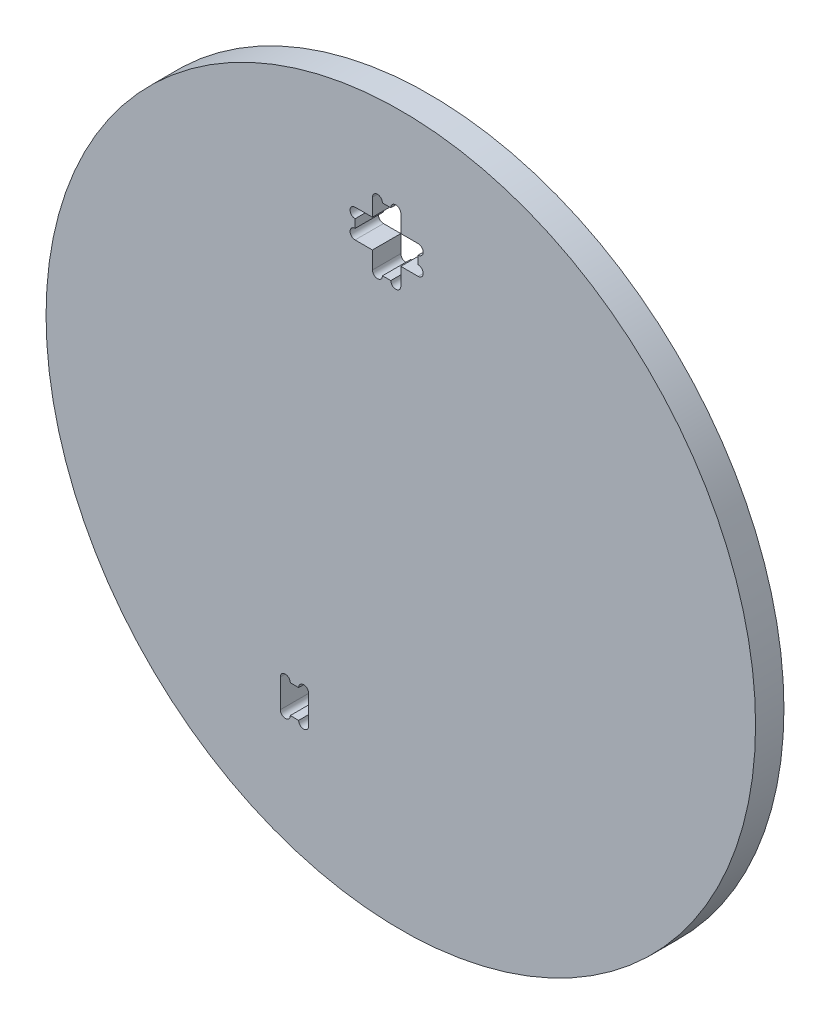
ISO-10303-21;
HEADER;
FILE_DESCRIPTION(('STEP AP214'),'2;1');
FILE_NAME('part.step','',(''),(''),'','','');
FILE_SCHEMA(('AUTOMOTIVE_DESIGN { 1 0 10303 214 1 1 1 1 }'));
ENDSEC;
DATA;
#1=APPLICATION_CONTEXT('core data for automotive mechanical design processes');
#2=APPLICATION_PROTOCOL_DEFINITION('international standard','automotive_design',2000,#1);
#3=PRODUCT_CONTEXT('',#1,'mechanical');
#4=PRODUCT('Part','Part','',(#3));
#5=PRODUCT_RELATED_PRODUCT_CATEGORY('part','',(#4));
#6=PRODUCT_DEFINITION_FORMATION('','',#4);
#7=PRODUCT_DEFINITION_CONTEXT('part definition',#1,'design');
#8=PRODUCT_DEFINITION('design','',#6,#7);
#9=PRODUCT_DEFINITION_SHAPE('','',#8);
#10=(LENGTH_UNIT() NAMED_UNIT(*) SI_UNIT(.MILLI.,.METRE.));
#11=(NAMED_UNIT(*) PLANE_ANGLE_UNIT() SI_UNIT($,.RADIAN.));
#12=(NAMED_UNIT(*) SI_UNIT($,.STERADIAN.) SOLID_ANGLE_UNIT());
#13=UNCERTAINTY_MEASURE_WITH_UNIT(LENGTH_MEASURE(1.E-05),#10,'distance_accuracy_value','');
#14=(GEOMETRIC_REPRESENTATION_CONTEXT(3) GLOBAL_UNCERTAINTY_ASSIGNED_CONTEXT((#13)) GLOBAL_UNIT_ASSIGNED_CONTEXT((#10,
#11,#12)) REPRESENTATION_CONTEXT('',''));
#15=CARTESIAN_POINT('',(0.,0.,0.));
#16=DIRECTION('',(0.,0.,1.));
#17=DIRECTION('',(1.,0.,0.));
#18=AXIS2_PLACEMENT_3D('',#15,#16,#17);
#19=CARTESIAN_POINT('',(0.,0.,18.));
#20=DIRECTION('',(0.,0.,1.));
#21=DIRECTION('',(1.,0.,0.));
#22=AXIS2_PLACEMENT_3D('',#19,#20,#21);
#23=PLANE('',#22);
#24=CARTESIAN_POINT('',(0.,0.,18.));
#25=DIRECTION('',(0.,0.,1.));
#26=DIRECTION('',(1.,0.,0.));
#27=AXIS2_PLACEMENT_3D('',#24,#25,#26);
#28=CIRCLE('',#27,225.);
#29=CARTESIAN_POINT('',(225.,0.,18.));
#30=VERTEX_POINT('',#29);
#31=EDGE_CURVE('E11',#30,#30,#28,.T.);
#32=ORIENTED_EDGE('',*,*,#31,.T.);
#33=EDGE_LOOP('',(#32));
#34=FACE_BOUND('',#33,.T.);
#35=DIRECTION('',(0.,1.,0.));
#36=VECTOR('',#35,1.);
#37=CARTESIAN_POINT('',(-29.,0.,18.));
#38=LINE('',#37,#36);
#39=CARTESIAN_POINT('',(-29.,145.778927822485,18.));
#40=VERTEX_POINT('',#39);
#41=CARTESIAN_POINT('',(-29.,151.078927822484,18.));
#42=VERTEX_POINT('',#41);
#43=EDGE_CURVE('E430',#40,#42,#38,.T.);
#44=ORIENTED_EDGE('',*,*,#43,.T.);
#45=CARTESIAN_POINT('',(-29.,154.253927822484,18.));
#46=DIRECTION('',(0.,0.,1.));
#47=DIRECTION('',(1.,0.,0.));
#48=AXIS2_PLACEMENT_3D('',#45,#46,#47);
#49=CIRCLE('',#48,3.17500000000004);
#50=CARTESIAN_POINT('',(-29.,157.428927822485,18.));
#51=VERTEX_POINT('',#50);
#52=EDGE_CURVE('E433',#42,#51,#49,.F.);
#53=ORIENTED_EDGE('',*,*,#52,.T.);
#54=DIRECTION('',(-1.,0.,0.));
#55=VECTOR('',#54,1.);
#56=CARTESIAN_POINT('',(0.,157.428927822485,18.));
#57=LINE('',#56,#55);
#58=CARTESIAN_POINT('',(-18.,157.428927822485,18.));
#59=VERTEX_POINT('',#58);
#60=EDGE_CURVE('E386',#59,#51,#57,.T.);
#61=ORIENTED_EDGE('',*,*,#60,.F.);
#62=DIRECTION('',(0.,1.,0.));
#63=VECTOR('',#62,1.);
#64=CARTESIAN_POINT('',(-17.9999999999999,0.,18.));
#65=LINE('',#64,#63);
#66=CARTESIAN_POINT('',(-18.,168.428927822484,18.));
#67=VERTEX_POINT('',#66);
#68=EDGE_CURVE('E388',#59,#67,#65,.T.);
#69=ORIENTED_EDGE('',*,*,#68,.T.);
#70=CARTESIAN_POINT('',(-14.8250000000001,168.428927822484,18.));
#71=DIRECTION('',(0.,0.,1.));
#72=DIRECTION('',(1.,0.,0.));
#73=AXIS2_PLACEMENT_3D('',#70,#71,#72);
#74=CIRCLE('',#73,3.17499999999996);
#75=CARTESIAN_POINT('',(-11.6500000000001,168.428927822485,18.));
#76=VERTEX_POINT('',#75);
#77=EDGE_CURVE('E391',#76,#67,#74,.T.);
#78=ORIENTED_EDGE('',*,*,#77,.F.);
#79=DIRECTION('',(-1.,0.,0.));
#80=VECTOR('',#79,1.);
#81=CARTESIAN_POINT('',(0.,168.428927822485,18.));
#82=LINE('',#81,#80);
#83=CARTESIAN_POINT('',(-6.35,168.428927822485,18.));
#84=VERTEX_POINT('',#83);
#85=EDGE_CURVE('E393',#84,#76,#82,.T.);
#86=ORIENTED_EDGE('',*,*,#85,.F.);
#87=CARTESIAN_POINT('',(-3.175,168.428927822484,18.));
#88=DIRECTION('',(0.,0.,1.));
#89=DIRECTION('',(1.,0.,0.));
#90=AXIS2_PLACEMENT_3D('',#87,#88,#89);
#91=CIRCLE('',#90,3.175);
#92=CARTESIAN_POINT('',(0.,168.428927822485,18.));
#93=VERTEX_POINT('',#92);
#94=EDGE_CURVE('E395',#84,#93,#91,.F.);
#95=ORIENTED_EDGE('',*,*,#94,.T.);
#96=DIRECTION('',(0.,1.,0.));
#97=VECTOR('',#96,1.);
#98=CARTESIAN_POINT('',(0.,0.,18.));
#99=LINE('',#98,#97);
#100=CARTESIAN_POINT('',(0.,157.428927822485,18.));
#101=VERTEX_POINT('',#100);
#102=EDGE_CURVE('E398',#101,#93,#99,.T.);
#103=ORIENTED_EDGE('',*,*,#102,.F.);
#104=DIRECTION('',(-1.,0.,0.));
#105=VECTOR('',#104,1.);
#106=CARTESIAN_POINT('',(0.,157.428927822485,18.));
#107=LINE('',#106,#105);
#108=CARTESIAN_POINT('',(11.,157.428927822485,18.));
#109=VERTEX_POINT('',#108);
#110=EDGE_CURVE('E400',#109,#101,#107,.T.);
#111=ORIENTED_EDGE('',*,*,#110,.F.);
#112=CARTESIAN_POINT('',(11.,154.253927822484,18.));
#113=DIRECTION('',(0.,0.,1.));
#114=DIRECTION('',(1.,0.,0.));
#115=AXIS2_PLACEMENT_3D('',#112,#113,#114);
#116=CIRCLE('',#115,3.17500000000004);
#117=CARTESIAN_POINT('',(11.,151.078927822484,18.));
#118=VERTEX_POINT('',#117);
#119=EDGE_CURVE('E402',#118,#109,#116,.T.);
#120=ORIENTED_EDGE('',*,*,#119,.F.);
#121=DIRECTION('',(0.,1.,0.));
#122=VECTOR('',#121,1.);
#123=CARTESIAN_POINT('',(11.,0.,18.));
#124=LINE('',#123,#122);
#125=CARTESIAN_POINT('',(11.,145.778927822485,18.));
#126=VERTEX_POINT('',#125);
#127=EDGE_CURVE('E404',#126,#118,#124,.T.);
#128=ORIENTED_EDGE('',*,*,#127,.F.);
#129=CARTESIAN_POINT('',(11.,142.603927822485,18.));
#130=DIRECTION('',(0.,0.,1.));
#131=DIRECTION('',(1.,0.,0.));
#132=AXIS2_PLACEMENT_3D('',#129,#130,#131);
#133=CIRCLE('',#132,3.17500000000001);
#134=CARTESIAN_POINT('',(11.,139.428927822485,18.));
#135=VERTEX_POINT('',#134);
#136=EDGE_CURVE('E406',#126,#135,#133,.F.);
#137=ORIENTED_EDGE('',*,*,#136,.T.);
#138=DIRECTION('',(-1.,0.,0.));
#139=VECTOR('',#138,1.);
#140=CARTESIAN_POINT('',(0.,139.428927822485,18.));
#141=LINE('',#140,#139);
#142=CARTESIAN_POINT('',(0.,139.428927822485,18.));
#143=VERTEX_POINT('',#142);
#144=EDGE_CURVE('E409',#135,#143,#141,.T.);
#145=ORIENTED_EDGE('',*,*,#144,.T.);
#146=DIRECTION('',(0.,1.,0.));
#147=VECTOR('',#146,1.);
#148=CARTESIAN_POINT('',(0.,0.,18.));
#149=LINE('',#148,#147);
#150=CARTESIAN_POINT('',(0.,128.428927822485,18.));
#151=VERTEX_POINT('',#150);
#152=EDGE_CURVE('E412',#151,#143,#149,.T.);
#153=ORIENTED_EDGE('',*,*,#152,.F.);
#154=CARTESIAN_POINT('',(-3.175,128.428927822485,18.));
#155=DIRECTION('',(0.,0.,1.));
#156=DIRECTION('',(1.,0.,0.));
#157=AXIS2_PLACEMENT_3D('',#154,#155,#156);
#158=CIRCLE('',#157,3.175);
#159=CARTESIAN_POINT('',(-6.35000000000001,128.428927822485,18.));
#160=VERTEX_POINT('',#159);
#161=EDGE_CURVE('E414',#160,#151,#158,.T.);
#162=ORIENTED_EDGE('',*,*,#161,.F.);
#163=DIRECTION('',(-1.,0.,0.));
#164=VECTOR('',#163,1.);
#165=CARTESIAN_POINT('',(0.,128.428927822485,18.));
#166=LINE('',#165,#164);
#167=CARTESIAN_POINT('',(-11.6500000000001,128.428927822485,18.));
#168=VERTEX_POINT('',#167);
#169=EDGE_CURVE('E416',#160,#168,#166,.T.);
#170=ORIENTED_EDGE('',*,*,#169,.T.);
#171=CARTESIAN_POINT('',(-14.8250000000001,128.428927822485,18.));
#172=DIRECTION('',(0.,0.,1.));
#173=DIRECTION('',(1.,0.,0.));
#174=AXIS2_PLACEMENT_3D('',#171,#172,#173);
#175=CIRCLE('',#174,3.17499999999996);
#176=CARTESIAN_POINT('',(-18.,128.428927822484,18.));
#177=VERTEX_POINT('',#176);
#178=EDGE_CURVE('E419',#168,#177,#175,.F.);
#179=ORIENTED_EDGE('',*,*,#178,.T.);
#180=DIRECTION('',(0.,1.,0.));
#181=VECTOR('',#180,1.);
#182=CARTESIAN_POINT('',(-18.,0.,18.));
#183=LINE('',#182,#181);
#184=CARTESIAN_POINT('',(-18.,139.428927822485,18.));
#185=VERTEX_POINT('',#184);
#186=EDGE_CURVE('E422',#177,#185,#183,.T.);
#187=ORIENTED_EDGE('',*,*,#186,.T.);
#188=DIRECTION('',(-1.,0.,0.));
#189=VECTOR('',#188,1.);
#190=CARTESIAN_POINT('',(0.,139.428927822485,18.));
#191=LINE('',#190,#189);
#192=CARTESIAN_POINT('',(-29.,139.428927822485,18.));
#193=VERTEX_POINT('',#192);
#194=EDGE_CURVE('E425',#185,#193,#191,.T.);
#195=ORIENTED_EDGE('',*,*,#194,.T.);
#196=CARTESIAN_POINT('',(-29.,142.603927822485,18.));
#197=DIRECTION('',(0.,0.,1.));
#198=DIRECTION('',(1.,0.,0.));
#199=AXIS2_PLACEMENT_3D('',#196,#197,#198);
#200=CIRCLE('',#199,3.17500000000001);
#201=EDGE_CURVE('E428',#40,#193,#200,.T.);
#202=ORIENTED_EDGE('',*,*,#201,.F.);
#203=EDGE_LOOP('',(#44,#53,#61,#69,#78,#86,#95,#103,#111,#120,#128,#137,#145,#153,#162,#170,
#179,#187,#195,#202));
#204=FACE_BOUND('',#203,.T.);
#205=DIRECTION('',(-1.,0.,0.));
#206=VECTOR('',#205,1.);
#207=CARTESIAN_POINT('',(0.,-124.331072177516,18.));
#208=LINE('',#207,#206);
#209=CARTESIAN_POINT('',(-64.7972921540286,-124.331072177516,18.));
#210=VERTEX_POINT('',#209);
#211=CARTESIAN_POINT('',(-70.0972921540286,-124.331072177516,18.));
#212=VERTEX_POINT('',#211);
#213=EDGE_CURVE('E282',#210,#212,#208,.T.);
#214=ORIENTED_EDGE('',*,*,#213,.F.);
#215=CARTESIAN_POINT('',(-61.6222921540286,-124.331072177516,18.));
#216=DIRECTION('',(0.,0.,1.));
#217=DIRECTION('',(1.,0.,0.));
#218=AXIS2_PLACEMENT_3D('',#215,#216,#217);
#219=CIRCLE('',#218,3.175);
#220=CARTESIAN_POINT('',(-58.4472921540286,-124.331072177516,18.));
#221=VERTEX_POINT('',#220);
#222=EDGE_CURVE('E221',#210,#221,#219,.F.);
#223=ORIENTED_EDGE('',*,*,#222,.T.);
#224=DIRECTION('',(0.,1.,0.));
#225=VECTOR('',#224,1.);
#226=CARTESIAN_POINT('',(-58.4472921540288,0.,18.));
#227=LINE('',#226,#225);
#228=CARTESIAN_POINT('',(-58.4472921540285,-142.331072177516,18.));
#229=VERTEX_POINT('',#228);
#230=EDGE_CURVE('E224',#229,#221,#227,.T.);
#231=ORIENTED_EDGE('',*,*,#230,.F.);
#232=CARTESIAN_POINT('',(-61.6222921540286,-142.331072177515,18.));
#233=DIRECTION('',(0.,0.,1.));
#234=DIRECTION('',(1.,0.,0.));
#235=AXIS2_PLACEMENT_3D('',#232,#233,#234);
#236=CIRCLE('',#235,3.17500000000002);
#237=CARTESIAN_POINT('',(-64.7972921540286,-142.331072177515,18.));
#238=VERTEX_POINT('',#237);
#239=EDGE_CURVE('E269',#238,#229,#236,.T.);
#240=ORIENTED_EDGE('',*,*,#239,.F.);
#241=DIRECTION('',(-1.,0.,0.));
#242=VECTOR('',#241,1.);
#243=CARTESIAN_POINT('',(0.,-142.331072177515,18.));
#244=LINE('',#243,#242);
#245=CARTESIAN_POINT('',(-70.0972921540286,-142.331072177515,18.));
#246=VERTEX_POINT('',#245);
#247=EDGE_CURVE('E271',#238,#246,#244,.T.);
#248=ORIENTED_EDGE('',*,*,#247,.T.);
#249=CARTESIAN_POINT('',(-73.2722921540286,-142.331072177515,18.));
#250=DIRECTION('',(0.,0.,1.));
#251=DIRECTION('',(1.,0.,0.));
#252=AXIS2_PLACEMENT_3D('',#249,#250,#251);
#253=CIRCLE('',#252,3.175);
#254=CARTESIAN_POINT('',(-76.4472921540286,-142.331072177515,18.));
#255=VERTEX_POINT('',#254);
#256=EDGE_CURVE('E274',#246,#255,#253,.F.);
#257=ORIENTED_EDGE('',*,*,#256,.T.);
#258=DIRECTION('',(0.,1.,0.));
#259=VECTOR('',#258,1.);
#260=CARTESIAN_POINT('',(-76.4472921540286,0.,18.));
#261=LINE('',#260,#259);
#262=CARTESIAN_POINT('',(-76.4472921540286,-124.331072177516,18.));
#263=VERTEX_POINT('',#262);
#264=EDGE_CURVE('E277',#255,#263,#261,.T.);
#265=ORIENTED_EDGE('',*,*,#264,.T.);
#266=CARTESIAN_POINT('',(-73.2722921540286,-124.331072177516,18.));
#267=DIRECTION('',(0.,0.,1.));
#268=DIRECTION('',(1.,0.,0.));
#269=AXIS2_PLACEMENT_3D('',#266,#267,#268);
#270=CIRCLE('',#269,3.175);
#271=EDGE_CURVE('E280',#212,#263,#270,.T.);
#272=ORIENTED_EDGE('',*,*,#271,.F.);
#273=EDGE_LOOP('',(#214,#223,#231,#240,#248,#257,#265,#272));
#274=FACE_BOUND('',#273,.T.);
#275=ADVANCED_FACE('F33',(#34,#204,#274),#23,.T.);
#276=CARTESIAN_POINT('',(0.,0.,0.));
#277=DIRECTION('',(0.,0.,1.));
#278=DIRECTION('',(1.,0.,0.));
#279=AXIS2_PLACEMENT_3D('',#276,#277,#278);
#280=PLANE('',#279);
#281=CARTESIAN_POINT('',(-29.,154.253927822484,0.));
#282=DIRECTION('',(0.,0.,1.));
#283=DIRECTION('',(1.,0.,0.));
#284=AXIS2_PLACEMENT_3D('',#281,#282,#283);
#285=CIRCLE('',#284,3.17500000000004);
#286=CARTESIAN_POINT('',(-29.,157.428927822485,0.));
#287=VERTEX_POINT('',#286);
#288=CARTESIAN_POINT('',(-29.,151.078927822484,0.));
#289=VERTEX_POINT('',#288);
#290=EDGE_CURVE('E285',#287,#289,#285,.T.);
#291=ORIENTED_EDGE('',*,*,#290,.T.);
#292=DIRECTION('',(0.,-1.,0.));
#293=VECTOR('',#292,1.);
#294=CARTESIAN_POINT('',(-29.,151.078927822484,0.));
#295=LINE('',#294,#293);
#296=CARTESIAN_POINT('',(-29.,145.778927822485,0.));
#297=VERTEX_POINT('',#296);
#298=EDGE_CURVE('E288',#289,#297,#295,.T.);
#299=ORIENTED_EDGE('',*,*,#298,.T.);
#300=CARTESIAN_POINT('',(-29.,142.603927822485,0.));
#301=DIRECTION('',(0.,0.,-1.));
#302=DIRECTION('',(-1.,0.,0.));
#303=AXIS2_PLACEMENT_3D('',#300,#301,#302);
#304=CIRCLE('',#303,3.17500000000001);
#305=CARTESIAN_POINT('',(-29.,139.428927822485,0.));
#306=VERTEX_POINT('',#305);
#307=EDGE_CURVE('E291',#306,#297,#304,.T.);
#308=ORIENTED_EDGE('',*,*,#307,.F.);
#309=DIRECTION('',(1.,0.,0.));
#310=VECTOR('',#309,1.);
#311=CARTESIAN_POINT('',(-29.,139.428927822485,0.));
#312=LINE('',#311,#310);
#313=CARTESIAN_POINT('',(-18.,139.428927822485,0.));
#314=VERTEX_POINT('',#313);
#315=EDGE_CURVE('E294',#306,#314,#312,.T.);
#316=ORIENTED_EDGE('',*,*,#315,.T.);
#317=DIRECTION('',(0.,-1.,0.));
#318=VECTOR('',#317,1.);
#319=CARTESIAN_POINT('',(-18.,139.428927822485,0.));
#320=LINE('',#319,#318);
#321=CARTESIAN_POINT('',(-18.,128.428927822484,0.));
#322=VERTEX_POINT('',#321);
#323=EDGE_CURVE('E297',#314,#322,#320,.T.);
#324=ORIENTED_EDGE('',*,*,#323,.T.);
#325=CARTESIAN_POINT('',(-14.8250000000001,128.428927822485,0.));
#326=DIRECTION('',(0.,0.,1.));
#327=DIRECTION('',(1.,0.,0.));
#328=AXIS2_PLACEMENT_3D('',#325,#326,#327);
#329=CIRCLE('',#328,3.17499999999996);
#330=CARTESIAN_POINT('',(-11.6500000000001,128.428927822485,0.));
#331=VERTEX_POINT('',#330);
#332=EDGE_CURVE('E300',#322,#331,#329,.T.);
#333=ORIENTED_EDGE('',*,*,#332,.T.);
#334=DIRECTION('',(1.,0.,0.));
#335=VECTOR('',#334,1.);
#336=CARTESIAN_POINT('',(-11.6500000000001,128.428927822485,0.));
#337=LINE('',#336,#335);
#338=CARTESIAN_POINT('',(-6.35000000000001,128.428927822485,0.));
#339=VERTEX_POINT('',#338);
#340=EDGE_CURVE('E303',#331,#339,#337,.T.);
#341=ORIENTED_EDGE('',*,*,#340,.T.);
#342=CARTESIAN_POINT('',(-3.175,128.428927822485,0.));
#343=DIRECTION('',(0.,0.,-1.));
#344=DIRECTION('',(-1.,0.,0.));
#345=AXIS2_PLACEMENT_3D('',#342,#343,#344);
#346=CIRCLE('',#345,3.175);
#347=CARTESIAN_POINT('',(0.,128.428927822485,0.));
#348=VERTEX_POINT('',#347);
#349=EDGE_CURVE('E306',#348,#339,#346,.T.);
#350=ORIENTED_EDGE('',*,*,#349,.F.);
#351=DIRECTION('',(0.,-1.,0.));
#352=VECTOR('',#351,1.);
#353=CARTESIAN_POINT('',(0.,139.428927822485,0.));
#354=LINE('',#353,#352);
#355=CARTESIAN_POINT('',(0.,139.428927822485,0.));
#356=VERTEX_POINT('',#355);
#357=EDGE_CURVE('E309',#356,#348,#354,.T.);
#358=ORIENTED_EDGE('',*,*,#357,.F.);
#359=DIRECTION('',(1.,0.,0.));
#360=VECTOR('',#359,1.);
#361=CARTESIAN_POINT('',(0.,139.428927822485,0.));
#362=LINE('',#361,#360);
#363=CARTESIAN_POINT('',(11.,139.428927822485,0.));
#364=VERTEX_POINT('',#363);
#365=EDGE_CURVE('E312',#356,#364,#362,.T.);
#366=ORIENTED_EDGE('',*,*,#365,.T.);
#367=CARTESIAN_POINT('',(11.,142.603927822485,0.));
#368=DIRECTION('',(0.,0.,1.));
#369=DIRECTION('',(1.,0.,0.));
#370=AXIS2_PLACEMENT_3D('',#367,#368,#369);
#371=CIRCLE('',#370,3.17500000000001);
#372=CARTESIAN_POINT('',(11.,145.778927822485,0.));
#373=VERTEX_POINT('',#372);
#374=EDGE_CURVE('E315',#364,#373,#371,.T.);
#375=ORIENTED_EDGE('',*,*,#374,.T.);
#376=DIRECTION('',(0.,-1.,0.));
#377=VECTOR('',#376,1.);
#378=CARTESIAN_POINT('',(11.,151.078927822484,0.));
#379=LINE('',#378,#377);
#380=CARTESIAN_POINT('',(11.,151.078927822484,0.));
#381=VERTEX_POINT('',#380);
#382=EDGE_CURVE('E318',#381,#373,#379,.T.);
#383=ORIENTED_EDGE('',*,*,#382,.F.);
#384=CARTESIAN_POINT('',(11.,154.253927822484,0.));
#385=DIRECTION('',(0.,0.,-1.));
#386=DIRECTION('',(-1.,0.,0.));
#387=AXIS2_PLACEMENT_3D('',#384,#385,#386);
#388=CIRCLE('',#387,3.17500000000004);
#389=CARTESIAN_POINT('',(11.,157.428927822485,0.));
#390=VERTEX_POINT('',#389);
#391=EDGE_CURVE('E321',#390,#381,#388,.T.);
#392=ORIENTED_EDGE('',*,*,#391,.F.);
#393=DIRECTION('',(1.,0.,0.));
#394=VECTOR('',#393,1.);
#395=CARTESIAN_POINT('',(0.,157.428927822485,0.));
#396=LINE('',#395,#394);
#397=CARTESIAN_POINT('',(0.,157.428927822485,0.));
#398=VERTEX_POINT('',#397);
#399=EDGE_CURVE('E324',#398,#390,#396,.T.);
#400=ORIENTED_EDGE('',*,*,#399,.F.);
#401=DIRECTION('',(0.,-1.,0.));
#402=VECTOR('',#401,1.);
#403=CARTESIAN_POINT('',(0.,168.428927822485,0.));
#404=LINE('',#403,#402);
#405=CARTESIAN_POINT('',(0.,168.428927822485,0.));
#406=VERTEX_POINT('',#405);
#407=EDGE_CURVE('E327',#406,#398,#404,.T.);
#408=ORIENTED_EDGE('',*,*,#407,.F.);
#409=CARTESIAN_POINT('',(-3.175,168.428927822484,0.));
#410=DIRECTION('',(0.,0.,1.));
#411=DIRECTION('',(1.,0.,0.));
#412=AXIS2_PLACEMENT_3D('',#409,#410,#411);
#413=CIRCLE('',#412,3.175);
#414=CARTESIAN_POINT('',(-6.35,168.428927822485,0.));
#415=VERTEX_POINT('',#414);
#416=EDGE_CURVE('E330',#406,#415,#413,.T.);
#417=ORIENTED_EDGE('',*,*,#416,.T.);
#418=DIRECTION('',(1.,0.,0.));
#419=VECTOR('',#418,1.);
#420=CARTESIAN_POINT('',(-11.6500000000001,168.428927822485,0.));
#421=LINE('',#420,#419);
#422=CARTESIAN_POINT('',(-11.6500000000001,168.428927822485,0.));
#423=VERTEX_POINT('',#422);
#424=EDGE_CURVE('E333',#423,#415,#421,.T.);
#425=ORIENTED_EDGE('',*,*,#424,.F.);
#426=CARTESIAN_POINT('',(-14.8250000000001,168.428927822484,0.));
#427=DIRECTION('',(0.,0.,-1.));
#428=DIRECTION('',(-1.,0.,0.));
#429=AXIS2_PLACEMENT_3D('',#426,#427,#428);
#430=CIRCLE('',#429,3.17499999999996);
#431=CARTESIAN_POINT('',(-18.,168.428927822484,0.));
#432=VERTEX_POINT('',#431);
#433=EDGE_CURVE('E336',#432,#423,#430,.T.);
#434=ORIENTED_EDGE('',*,*,#433,.F.);
#435=DIRECTION('',(0.,-1.,0.));
#436=VECTOR('',#435,1.);
#437=CARTESIAN_POINT('',(-18.,168.428927822484,0.));
#438=LINE('',#437,#436);
#439=CARTESIAN_POINT('',(-18.,157.428927822485,0.));
#440=VERTEX_POINT('',#439);
#441=EDGE_CURVE('E339',#432,#440,#438,.T.);
#442=ORIENTED_EDGE('',*,*,#441,.T.);
#443=DIRECTION('',(1.,0.,0.));
#444=VECTOR('',#443,1.);
#445=CARTESIAN_POINT('',(-29.,157.428927822485,0.));
#446=LINE('',#445,#444);
#447=EDGE_CURVE('E342',#287,#440,#446,.T.);
#448=ORIENTED_EDGE('',*,*,#447,.F.);
#449=EDGE_LOOP('',(#291,#299,#308,#316,#324,#333,#341,#350,#358,#366,#375,#383,#392,#400,#408,
#417,#425,#434,#442,#448));
#450=FACE_BOUND('',#449,.T.);
#451=CARTESIAN_POINT('',(0.,0.,0.));
#452=DIRECTION('',(0.,0.,1.));
#453=DIRECTION('',(1.,0.,0.));
#454=AXIS2_PLACEMENT_3D('',#451,#452,#453);
#455=CIRCLE('',#454,225.);
#456=CARTESIAN_POINT('',(225.,0.,0.));
#457=VERTEX_POINT('',#456);
#458=EDGE_CURVE('E37',#457,#457,#455,.T.);
#459=ORIENTED_EDGE('',*,*,#458,.F.);
#460=EDGE_LOOP('',(#459));
#461=FACE_BOUND('',#460,.T.);
#462=CARTESIAN_POINT('',(-61.6222921540286,-124.331072177516,0.));
#463=DIRECTION('',(0.,0.,1.));
#464=DIRECTION('',(1.,0.,0.));
#465=AXIS2_PLACEMENT_3D('',#462,#463,#464);
#466=CIRCLE('',#465,3.175);
#467=CARTESIAN_POINT('',(-58.4472921540286,-124.331072177516,0.));
#468=VERTEX_POINT('',#467);
#469=CARTESIAN_POINT('',(-64.7972921540286,-124.331072177516,0.));
#470=VERTEX_POINT('',#469);
#471=EDGE_CURVE('E56',#468,#470,#466,.T.);
#472=ORIENTED_EDGE('',*,*,#471,.T.);
#473=DIRECTION('',(1.,0.,0.));
#474=VECTOR('',#473,1.);
#475=CARTESIAN_POINT('',(-70.0972921540286,-124.331072177516,0.));
#476=LINE('',#475,#474);
#477=CARTESIAN_POINT('',(-70.0972921540286,-124.331072177516,0.));
#478=VERTEX_POINT('',#477);
#479=EDGE_CURVE('E228',#478,#470,#476,.T.);
#480=ORIENTED_EDGE('',*,*,#479,.F.);
#481=CARTESIAN_POINT('',(-73.2722921540286,-124.331072177516,0.));
#482=DIRECTION('',(0.,0.,-1.));
#483=DIRECTION('',(-1.,0.,0.));
#484=AXIS2_PLACEMENT_3D('',#481,#482,#483);
#485=CIRCLE('',#484,3.175);
#486=CARTESIAN_POINT('',(-76.4472921540286,-124.331072177516,0.));
#487=VERTEX_POINT('',#486);
#488=EDGE_CURVE('E234',#487,#478,#485,.T.);
#489=ORIENTED_EDGE('',*,*,#488,.F.);
#490=DIRECTION('',(0.,-1.,0.));
#491=VECTOR('',#490,1.);
#492=CARTESIAN_POINT('',(-76.4472921540286,-124.331072177516,0.));
#493=LINE('',#492,#491);
#494=CARTESIAN_POINT('',(-76.4472921540286,-142.331072177515,0.));
#495=VERTEX_POINT('',#494);
#496=EDGE_CURVE('E243',#487,#495,#493,.T.);
#497=ORIENTED_EDGE('',*,*,#496,.T.);
#498=CARTESIAN_POINT('',(-73.2722921540286,-142.331072177515,0.));
#499=DIRECTION('',(0.,0.,1.));
#500=DIRECTION('',(1.,0.,0.));
#501=AXIS2_PLACEMENT_3D('',#498,#499,#500);
#502=CIRCLE('',#501,3.175);
#503=CARTESIAN_POINT('',(-70.0972921540286,-142.331072177515,0.));
#504=VERTEX_POINT('',#503);
#505=EDGE_CURVE('E246',#495,#504,#502,.T.);
#506=ORIENTED_EDGE('',*,*,#505,.T.);
#507=DIRECTION('',(1.,0.,0.));
#508=VECTOR('',#507,1.);
#509=CARTESIAN_POINT('',(-70.0972921540286,-142.331072177515,0.));
#510=LINE('',#509,#508);
#511=CARTESIAN_POINT('',(-64.7972921540286,-142.331072177515,0.));
#512=VERTEX_POINT('',#511);
#513=EDGE_CURVE('E249',#504,#512,#510,.T.);
#514=ORIENTED_EDGE('',*,*,#513,.T.);
#515=CARTESIAN_POINT('',(-61.6222921540286,-142.331072177515,0.));
#516=DIRECTION('',(0.,0.,-1.));
#517=DIRECTION('',(-1.,0.,0.));
#518=AXIS2_PLACEMENT_3D('',#515,#516,#517);
#519=CIRCLE('',#518,3.17500000000002);
#520=CARTESIAN_POINT('',(-58.4472921540285,-142.331072177516,0.));
#521=VERTEX_POINT('',#520);
#522=EDGE_CURVE('E252',#521,#512,#519,.T.);
#523=ORIENTED_EDGE('',*,*,#522,.F.);
#524=DIRECTION('',(0.,-1.,0.));
#525=VECTOR('',#524,1.);
#526=CARTESIAN_POINT('',(-58.4472921540286,-124.331072177516,0.));
#527=LINE('',#526,#525);
#528=EDGE_CURVE('E239',#468,#521,#527,.T.);
#529=ORIENTED_EDGE('',*,*,#528,.F.);
#530=EDGE_LOOP('',(#472,#480,#489,#497,#506,#514,#523,#529));
#531=FACE_BOUND('',#530,.T.);
#532=ADVANCED_FACE('F237',(#450,#461,#531),#280,.F.);
#533=CARTESIAN_POINT('',(0.,0.,18.));
#534=DIRECTION('',(0.,0.,-1.));
#535=DIRECTION('',(-1.,0.,0.));
#536=AXIS2_PLACEMENT_3D('',#533,#534,#535);
#537=CYLINDRICAL_SURFACE('',#536,225.);
#538=ORIENTED_EDGE('',*,*,#31,.F.);
#539=EDGE_LOOP('',(#538));
#540=FACE_BOUND('',#539,.T.);
#541=ORIENTED_EDGE('',*,*,#458,.T.);
#542=EDGE_LOOP('',(#541));
#543=FACE_BOUND('',#542,.T.);
#544=ADVANCED_FACE('F35',(#540,#543),#537,.T.);
#545=CARTESIAN_POINT('',(-29.,154.253927822484,56.));
#546=DIRECTION('',(0.,0.,-1.));
#547=DIRECTION('',(-1.,0.,0.));
#548=AXIS2_PLACEMENT_3D('',#545,#546,#547);
#549=CYLINDRICAL_SURFACE('',#548,3.17500000000004);
#550=DIRECTION('',(0.,0.,-1.));
#551=VECTOR('',#550,1.);
#552=CARTESIAN_POINT('',(-29.,151.078927822484,56.));
#553=LINE('',#552,#551);
#554=EDGE_CURVE('E384',#42,#289,#553,.T.);
#555=ORIENTED_EDGE('',*,*,#554,.T.);
#556=ORIENTED_EDGE('',*,*,#290,.F.);
#557=DIRECTION('',(0.,0.,-1.));
#558=VECTOR('',#557,1.);
#559=CARTESIAN_POINT('',(-29.,157.428927822485,56.));
#560=LINE('',#559,#558);
#561=EDGE_CURVE('E345',#51,#287,#560,.T.);
#562=ORIENTED_EDGE('',*,*,#561,.F.);
#563=ORIENTED_EDGE('',*,*,#52,.F.);
#564=EDGE_LOOP('',(#555,#556,#562,#563));
#565=FACE_BOUND('',#564,.T.);
#566=ADVANCED_FACE('F447',(#565),#549,.F.);
#567=CARTESIAN_POINT('',(-29.,151.078927822484,56.));
#568=DIRECTION('',(1.,0.,0.));
#569=DIRECTION('',(0.,0.,-1.));
#570=AXIS2_PLACEMENT_3D('',#567,#568,#569);
#571=PLANE('',#570);
#572=DIRECTION('',(0.,0.,-1.));
#573=VECTOR('',#572,1.);
#574=CARTESIAN_POINT('',(-29.,145.778927822485,56.));
#575=LINE('',#574,#573);
#576=EDGE_CURVE('E382',#40,#297,#575,.T.);
#577=ORIENTED_EDGE('',*,*,#576,.T.);
#578=ORIENTED_EDGE('',*,*,#298,.F.);
#579=ORIENTED_EDGE('',*,*,#554,.F.);
#580=ORIENTED_EDGE('',*,*,#43,.F.);
#581=EDGE_LOOP('',(#577,#578,#579,#580));
#582=FACE_BOUND('',#581,.T.);
#583=ADVANCED_FACE('F454',(#582),#571,.T.);
#584=CARTESIAN_POINT('',(-29.,142.603927822485,56.));
#585=DIRECTION('',(0.,0.,-1.));
#586=DIRECTION('',(-1.,0.,0.));
#587=AXIS2_PLACEMENT_3D('',#584,#585,#586);
#588=CYLINDRICAL_SURFACE('',#587,3.17500000000001);
#589=ORIENTED_EDGE('',*,*,#201,.T.);
#590=DIRECTION('',(0.,0.,-1.));
#591=VECTOR('',#590,1.);
#592=CARTESIAN_POINT('',(-29.,139.428927822485,56.));
#593=LINE('',#592,#591);
#594=EDGE_CURVE('E380',#193,#306,#593,.T.);
#595=ORIENTED_EDGE('',*,*,#594,.T.);
#596=ORIENTED_EDGE('',*,*,#307,.T.);
#597=ORIENTED_EDGE('',*,*,#576,.F.);
#598=EDGE_LOOP('',(#589,#595,#596,#597));
#599=FACE_BOUND('',#598,.T.);
#600=ADVANCED_FACE('F458',(#599),#588,.F.);
#601=CARTESIAN_POINT('',(-29.,139.428927822485,56.));
#602=DIRECTION('',(0.,1.,0.));
#603=DIRECTION('',(0.,0.,1.));
#604=AXIS2_PLACEMENT_3D('',#601,#602,#603);
#605=PLANE('',#604);
#606=DIRECTION('',(0.,0.,-1.));
#607=VECTOR('',#606,1.);
#608=CARTESIAN_POINT('',(-18.,139.428927822485,56.));
#609=LINE('',#608,#607);
#610=EDGE_CURVE('E378',#185,#314,#609,.T.);
#611=ORIENTED_EDGE('',*,*,#610,.T.);
#612=ORIENTED_EDGE('',*,*,#315,.F.);
#613=ORIENTED_EDGE('',*,*,#594,.F.);
#614=ORIENTED_EDGE('',*,*,#194,.F.);
#615=EDGE_LOOP('',(#611,#612,#613,#614));
#616=FACE_BOUND('',#615,.T.);
#617=ADVANCED_FACE('F462',(#616),#605,.T.);
#618=CARTESIAN_POINT('',(-18.,139.428927822485,56.));
#619=DIRECTION('',(1.,0.,0.));
#620=DIRECTION('',(0.,1.,0.));
#621=AXIS2_PLACEMENT_3D('',#618,#619,#620);
#622=PLANE('',#621);
#623=DIRECTION('',(0.,0.,-1.));
#624=VECTOR('',#623,1.);
#625=CARTESIAN_POINT('',(-18.,128.428927822484,56.));
#626=LINE('',#625,#624);
#627=EDGE_CURVE('E376',#177,#322,#626,.T.);
#628=ORIENTED_EDGE('',*,*,#627,.T.);
#629=ORIENTED_EDGE('',*,*,#323,.F.);
#630=ORIENTED_EDGE('',*,*,#610,.F.);
#631=ORIENTED_EDGE('',*,*,#186,.F.);
#632=EDGE_LOOP('',(#628,#629,#630,#631));
#633=FACE_BOUND('',#632,.T.);
#634=ADVANCED_FACE('F466',(#633),#622,.T.);
#635=CARTESIAN_POINT('',(-14.8250000000001,128.428927822485,56.));
#636=DIRECTION('',(0.,0.,-1.));
#637=DIRECTION('',(-1.,0.,0.));
#638=AXIS2_PLACEMENT_3D('',#635,#636,#637);
#639=CYLINDRICAL_SURFACE('',#638,3.17499999999996);
#640=DIRECTION('',(0.,0.,-1.));
#641=VECTOR('',#640,1.);
#642=CARTESIAN_POINT('',(-11.6500000000001,128.428927822485,56.));
#643=LINE('',#642,#641);
#644=EDGE_CURVE('E374',#168,#331,#643,.T.);
#645=ORIENTED_EDGE('',*,*,#644,.T.);
#646=ORIENTED_EDGE('',*,*,#332,.F.);
#647=ORIENTED_EDGE('',*,*,#627,.F.);
#648=ORIENTED_EDGE('',*,*,#178,.F.);
#649=EDGE_LOOP('',(#645,#646,#647,#648));
#650=FACE_BOUND('',#649,.T.);
#651=ADVANCED_FACE('F470',(#650),#639,.F.);
#652=CARTESIAN_POINT('',(-11.6500000000001,128.428927822485,56.));
#653=DIRECTION('',(0.,1.,0.));
#654=DIRECTION('',(0.,0.,1.));
#655=AXIS2_PLACEMENT_3D('',#652,#653,#654);
#656=PLANE('',#655);
#657=DIRECTION('',(0.,0.,-1.));
#658=VECTOR('',#657,1.);
#659=CARTESIAN_POINT('',(-6.35000000000001,128.428927822485,56.));
#660=LINE('',#659,#658);
#661=EDGE_CURVE('E372',#160,#339,#660,.T.);
#662=ORIENTED_EDGE('',*,*,#661,.T.);
#663=ORIENTED_EDGE('',*,*,#340,.F.);
#664=ORIENTED_EDGE('',*,*,#644,.F.);
#665=ORIENTED_EDGE('',*,*,#169,.F.);
#666=EDGE_LOOP('',(#662,#663,#664,#665));
#667=FACE_BOUND('',#666,.T.);
#668=ADVANCED_FACE('F474',(#667),#656,.T.);
#669=CARTESIAN_POINT('',(-3.175,128.428927822485,56.));
#670=DIRECTION('',(0.,0.,-1.));
#671=DIRECTION('',(-1.,0.,0.));
#672=AXIS2_PLACEMENT_3D('',#669,#670,#671);
#673=CYLINDRICAL_SURFACE('',#672,3.175);
#674=ORIENTED_EDGE('',*,*,#161,.T.);
#675=DIRECTION('',(0.,0.,-1.));
#676=VECTOR('',#675,1.);
#677=CARTESIAN_POINT('',(0.,128.428927822485,56.));
#678=LINE('',#677,#676);
#679=EDGE_CURVE('E370',#151,#348,#678,.T.);
#680=ORIENTED_EDGE('',*,*,#679,.T.);
#681=ORIENTED_EDGE('',*,*,#349,.T.);
#682=ORIENTED_EDGE('',*,*,#661,.F.);
#683=EDGE_LOOP('',(#674,#680,#681,#682));
#684=FACE_BOUND('',#683,.T.);
#685=ADVANCED_FACE('F478',(#684),#673,.F.);
#686=CARTESIAN_POINT('',(0.,139.428927822485,56.));
#687=DIRECTION('',(1.,0.,0.));
#688=DIRECTION('',(0.,1.,0.));
#689=AXIS2_PLACEMENT_3D('',#686,#687,#688);
#690=PLANE('',#689);
#691=ORIENTED_EDGE('',*,*,#152,.T.);
#692=DIRECTION('',(0.,0.,-1.));
#693=VECTOR('',#692,1.);
#694=CARTESIAN_POINT('',(0.,139.428927822485,56.));
#695=LINE('',#694,#693);
#696=EDGE_CURVE('E368',#143,#356,#695,.T.);
#697=ORIENTED_EDGE('',*,*,#696,.T.);
#698=ORIENTED_EDGE('',*,*,#357,.T.);
#699=ORIENTED_EDGE('',*,*,#679,.F.);
#700=EDGE_LOOP('',(#691,#697,#698,#699));
#701=FACE_BOUND('',#700,.T.);
#702=ADVANCED_FACE('F482',(#701),#690,.F.);
#703=CARTESIAN_POINT('',(0.,139.428927822485,56.));
#704=DIRECTION('',(0.,1.,0.));
#705=DIRECTION('',(0.,0.,1.));
#706=AXIS2_PLACEMENT_3D('',#703,#704,#705);
#707=PLANE('',#706);
#708=DIRECTION('',(0.,0.,-1.));
#709=VECTOR('',#708,1.);
#710=CARTESIAN_POINT('',(11.,139.428927822485,56.));
#711=LINE('',#710,#709);
#712=EDGE_CURVE('E366',#135,#364,#711,.T.);
#713=ORIENTED_EDGE('',*,*,#712,.T.);
#714=ORIENTED_EDGE('',*,*,#365,.F.);
#715=ORIENTED_EDGE('',*,*,#696,.F.);
#716=ORIENTED_EDGE('',*,*,#144,.F.);
#717=EDGE_LOOP('',(#713,#714,#715,#716));
#718=FACE_BOUND('',#717,.T.);
#719=ADVANCED_FACE('F486',(#718),#707,.T.);
#720=CARTESIAN_POINT('',(11.,142.603927822485,56.));
#721=DIRECTION('',(0.,0.,-1.));
#722=DIRECTION('',(-1.,0.,0.));
#723=AXIS2_PLACEMENT_3D('',#720,#721,#722);
#724=CYLINDRICAL_SURFACE('',#723,3.17500000000001);
#725=DIRECTION('',(0.,0.,-1.));
#726=VECTOR('',#725,1.);
#727=CARTESIAN_POINT('',(11.,145.778927822485,56.));
#728=LINE('',#727,#726);
#729=EDGE_CURVE('E364',#126,#373,#728,.T.);
#730=ORIENTED_EDGE('',*,*,#729,.T.);
#731=ORIENTED_EDGE('',*,*,#374,.F.);
#732=ORIENTED_EDGE('',*,*,#712,.F.);
#733=ORIENTED_EDGE('',*,*,#136,.F.);
#734=EDGE_LOOP('',(#730,#731,#732,#733));
#735=FACE_BOUND('',#734,.T.);
#736=ADVANCED_FACE('F490',(#735),#724,.F.);
#737=CARTESIAN_POINT('',(11.,151.078927822484,56.));
#738=DIRECTION('',(1.,0.,0.));
#739=DIRECTION('',(0.,1.,0.));
#740=AXIS2_PLACEMENT_3D('',#737,#738,#739);
#741=PLANE('',#740);
#742=ORIENTED_EDGE('',*,*,#127,.T.);
#743=DIRECTION('',(0.,0.,-1.));
#744=VECTOR('',#743,1.);
#745=CARTESIAN_POINT('',(11.,151.078927822484,56.));
#746=LINE('',#745,#744);
#747=EDGE_CURVE('E362',#118,#381,#746,.T.);
#748=ORIENTED_EDGE('',*,*,#747,.T.);
#749=ORIENTED_EDGE('',*,*,#382,.T.);
#750=ORIENTED_EDGE('',*,*,#729,.F.);
#751=EDGE_LOOP('',(#742,#748,#749,#750));
#752=FACE_BOUND('',#751,.T.);
#753=ADVANCED_FACE('F494',(#752),#741,.F.);
#754=CARTESIAN_POINT('',(11.,154.253927822484,56.));
#755=DIRECTION('',(0.,0.,-1.));
#756=DIRECTION('',(-1.,0.,0.));
#757=AXIS2_PLACEMENT_3D('',#754,#755,#756);
#758=CYLINDRICAL_SURFACE('',#757,3.17500000000004);
#759=ORIENTED_EDGE('',*,*,#119,.T.);
#760=DIRECTION('',(0.,0.,-1.));
#761=VECTOR('',#760,1.);
#762=CARTESIAN_POINT('',(11.,157.428927822485,56.));
#763=LINE('',#762,#761);
#764=EDGE_CURVE('E360',#109,#390,#763,.T.);
#765=ORIENTED_EDGE('',*,*,#764,.T.);
#766=ORIENTED_EDGE('',*,*,#391,.T.);
#767=ORIENTED_EDGE('',*,*,#747,.F.);
#768=EDGE_LOOP('',(#759,#765,#766,#767));
#769=FACE_BOUND('',#768,.T.);
#770=ADVANCED_FACE('F498',(#769),#758,.F.);
#771=CARTESIAN_POINT('',(0.,157.428927822485,56.));
#772=DIRECTION('',(0.,1.,0.));
#773=DIRECTION('',(0.,0.,1.));
#774=AXIS2_PLACEMENT_3D('',#771,#772,#773);
#775=PLANE('',#774);
#776=ORIENTED_EDGE('',*,*,#110,.T.);
#777=DIRECTION('',(0.,0.,-1.));
#778=VECTOR('',#777,1.);
#779=CARTESIAN_POINT('',(0.,157.428927822485,56.));
#780=LINE('',#779,#778);
#781=EDGE_CURVE('E358',#101,#398,#780,.T.);
#782=ORIENTED_EDGE('',*,*,#781,.T.);
#783=ORIENTED_EDGE('',*,*,#399,.T.);
#784=ORIENTED_EDGE('',*,*,#764,.F.);
#785=EDGE_LOOP('',(#776,#782,#783,#784));
#786=FACE_BOUND('',#785,.T.);
#787=ADVANCED_FACE('F502',(#786),#775,.F.);
#788=CARTESIAN_POINT('',(0.,168.428927822485,56.));
#789=DIRECTION('',(1.,0.,0.));
#790=DIRECTION('',(0.,1.,0.));
#791=AXIS2_PLACEMENT_3D('',#788,#789,#790);
#792=PLANE('',#791);
#793=ORIENTED_EDGE('',*,*,#102,.T.);
#794=DIRECTION('',(0.,0.,-1.));
#795=VECTOR('',#794,1.);
#796=CARTESIAN_POINT('',(0.,168.428927822485,56.));
#797=LINE('',#796,#795);
#798=EDGE_CURVE('E356',#93,#406,#797,.T.);
#799=ORIENTED_EDGE('',*,*,#798,.T.);
#800=ORIENTED_EDGE('',*,*,#407,.T.);
#801=ORIENTED_EDGE('',*,*,#781,.F.);
#802=EDGE_LOOP('',(#793,#799,#800,#801));
#803=FACE_BOUND('',#802,.T.);
#804=ADVANCED_FACE('F506',(#803),#792,.F.);
#805=CARTESIAN_POINT('',(-3.175,168.428927822484,56.));
#806=DIRECTION('',(0.,0.,-1.));
#807=DIRECTION('',(-1.,0.,0.));
#808=AXIS2_PLACEMENT_3D('',#805,#806,#807);
#809=CYLINDRICAL_SURFACE('',#808,3.175);
#810=DIRECTION('',(0.,0.,-1.));
#811=VECTOR('',#810,1.);
#812=CARTESIAN_POINT('',(-6.35,168.428927822485,56.));
#813=LINE('',#812,#811);
#814=EDGE_CURVE('E354',#84,#415,#813,.T.);
#815=ORIENTED_EDGE('',*,*,#814,.T.);
#816=ORIENTED_EDGE('',*,*,#416,.F.);
#817=ORIENTED_EDGE('',*,*,#798,.F.);
#818=ORIENTED_EDGE('',*,*,#94,.F.);
#819=EDGE_LOOP('',(#815,#816,#817,#818));
#820=FACE_BOUND('',#819,.T.);
#821=ADVANCED_FACE('F510',(#820),#809,.F.);
#822=CARTESIAN_POINT('',(-11.6500000000001,168.428927822485,56.));
#823=DIRECTION('',(0.,1.,0.));
#824=DIRECTION('',(0.,0.,1.));
#825=AXIS2_PLACEMENT_3D('',#822,#823,#824);
#826=PLANE('',#825);
#827=ORIENTED_EDGE('',*,*,#85,.T.);
#828=DIRECTION('',(0.,0.,-1.));
#829=VECTOR('',#828,1.);
#830=CARTESIAN_POINT('',(-11.6500000000001,168.428927822485,56.));
#831=LINE('',#830,#829);
#832=EDGE_CURVE('E352',#76,#423,#831,.T.);
#833=ORIENTED_EDGE('',*,*,#832,.T.);
#834=ORIENTED_EDGE('',*,*,#424,.T.);
#835=ORIENTED_EDGE('',*,*,#814,.F.);
#836=EDGE_LOOP('',(#827,#833,#834,#835));
#837=FACE_BOUND('',#836,.T.);
#838=ADVANCED_FACE('F514',(#837),#826,.F.);
#839=CARTESIAN_POINT('',(-14.8250000000001,168.428927822484,56.));
#840=DIRECTION('',(0.,0.,-1.));
#841=DIRECTION('',(-1.,0.,0.));
#842=AXIS2_PLACEMENT_3D('',#839,#840,#841);
#843=CYLINDRICAL_SURFACE('',#842,3.17499999999996);
#844=ORIENTED_EDGE('',*,*,#77,.T.);
#845=DIRECTION('',(0.,0.,-1.));
#846=VECTOR('',#845,1.);
#847=CARTESIAN_POINT('',(-18.,168.428927822484,56.));
#848=LINE('',#847,#846);
#849=EDGE_CURVE('E350',#67,#432,#848,.T.);
#850=ORIENTED_EDGE('',*,*,#849,.T.);
#851=ORIENTED_EDGE('',*,*,#433,.T.);
#852=ORIENTED_EDGE('',*,*,#832,.F.);
#853=EDGE_LOOP('',(#844,#850,#851,#852));
#854=FACE_BOUND('',#853,.T.);
#855=ADVANCED_FACE('F518',(#854),#843,.F.);
#856=CARTESIAN_POINT('',(-18.,168.428927822484,56.));
#857=DIRECTION('',(1.,0.,0.));
#858=DIRECTION('',(0.,1.,0.));
#859=AXIS2_PLACEMENT_3D('',#856,#857,#858);
#860=PLANE('',#859);
#861=DIRECTION('',(0.,0.,-1.));
#862=VECTOR('',#861,1.);
#863=CARTESIAN_POINT('',(-18.,157.428927822485,56.));
#864=LINE('',#863,#862);
#865=EDGE_CURVE('E348',#59,#440,#864,.T.);
#866=ORIENTED_EDGE('',*,*,#865,.T.);
#867=ORIENTED_EDGE('',*,*,#441,.F.);
#868=ORIENTED_EDGE('',*,*,#849,.F.);
#869=ORIENTED_EDGE('',*,*,#68,.F.);
#870=EDGE_LOOP('',(#866,#867,#868,#869));
#871=FACE_BOUND('',#870,.T.);
#872=ADVANCED_FACE('F522',(#871),#860,.T.);
#873=CARTESIAN_POINT('',(-29.,157.428927822485,56.));
#874=DIRECTION('',(0.,1.,0.));
#875=DIRECTION('',(0.,0.,1.));
#876=AXIS2_PLACEMENT_3D('',#873,#874,#875);
#877=PLANE('',#876);
#878=ORIENTED_EDGE('',*,*,#60,.T.);
#879=ORIENTED_EDGE('',*,*,#561,.T.);
#880=ORIENTED_EDGE('',*,*,#447,.T.);
#881=ORIENTED_EDGE('',*,*,#865,.F.);
#882=EDGE_LOOP('',(#878,#879,#880,#881));
#883=FACE_BOUND('',#882,.T.);
#884=ADVANCED_FACE('F526',(#883),#877,.F.);
#885=CARTESIAN_POINT('',(-61.6222921540286,-124.331072177516,110.));
#886=DIRECTION('',(0.,0.,-1.));
#887=DIRECTION('',(-1.,0.,0.));
#888=AXIS2_PLACEMENT_3D('',#885,#886,#887);
#889=CYLINDRICAL_SURFACE('',#888,3.175);
#890=DIRECTION('',(0.,0.,-1.));
#891=VECTOR('',#890,1.);
#892=CARTESIAN_POINT('',(-64.7972921540286,-124.331072177516,110.));
#893=LINE('',#892,#891);
#894=EDGE_CURVE('E217',#210,#470,#893,.T.);
#895=ORIENTED_EDGE('',*,*,#894,.T.);
#896=ORIENTED_EDGE('',*,*,#471,.F.);
#897=DIRECTION('',(0.,0.,-1.));
#898=VECTOR('',#897,1.);
#899=CARTESIAN_POINT('',(-58.4472921540286,-124.331072177516,110.));
#900=LINE('',#899,#898);
#901=EDGE_CURVE('E256',#221,#468,#900,.T.);
#902=ORIENTED_EDGE('',*,*,#901,.F.);
#903=ORIENTED_EDGE('',*,*,#222,.F.);
#904=EDGE_LOOP('',(#895,#896,#902,#903));
#905=FACE_BOUND('',#904,.T.);
#906=ADVANCED_FACE('F219',(#905),#889,.F.);
#907=CARTESIAN_POINT('',(-70.0972921540286,-124.331072177516,110.));
#908=DIRECTION('',(0.,1.,0.));
#909=DIRECTION('',(0.,0.,1.));
#910=AXIS2_PLACEMENT_3D('',#907,#908,#909);
#911=PLANE('',#910);
#912=ORIENTED_EDGE('',*,*,#213,.T.);
#913=DIRECTION('',(0.,0.,-1.));
#914=VECTOR('',#913,1.);
#915=CARTESIAN_POINT('',(-70.0972921540286,-124.331072177516,110.));
#916=LINE('',#915,#914);
#917=EDGE_CURVE('E225',#212,#478,#916,.T.);
#918=ORIENTED_EDGE('',*,*,#917,.T.);
#919=ORIENTED_EDGE('',*,*,#479,.T.);
#920=ORIENTED_EDGE('',*,*,#894,.F.);
#921=EDGE_LOOP('',(#912,#918,#919,#920));
#922=FACE_BOUND('',#921,.T.);
#923=ADVANCED_FACE('F229',(#922),#911,.F.);
#924=CARTESIAN_POINT('',(-73.2722921540286,-124.331072177516,110.));
#925=DIRECTION('',(0.,0.,-1.));
#926=DIRECTION('',(-1.,0.,0.));
#927=AXIS2_PLACEMENT_3D('',#924,#925,#926);
#928=CYLINDRICAL_SURFACE('',#927,3.175);
#929=ORIENTED_EDGE('',*,*,#271,.T.);
#930=DIRECTION('',(0.,0.,-1.));
#931=VECTOR('',#930,1.);
#932=CARTESIAN_POINT('',(-76.4472921540286,-124.331072177516,110.));
#933=LINE('',#932,#931);
#934=EDGE_CURVE('E265',#263,#487,#933,.T.);
#935=ORIENTED_EDGE('',*,*,#934,.T.);
#936=ORIENTED_EDGE('',*,*,#488,.T.);
#937=ORIENTED_EDGE('',*,*,#917,.F.);
#938=EDGE_LOOP('',(#929,#935,#936,#937));
#939=FACE_BOUND('',#938,.T.);
#940=ADVANCED_FACE('F535',(#939),#928,.F.);
#941=CARTESIAN_POINT('',(-76.4472921540286,-124.331072177516,110.));
#942=DIRECTION('',(1.,0.,0.));
#943=DIRECTION('',(0.,0.,-1.));
#944=AXIS2_PLACEMENT_3D('',#941,#942,#943);
#945=PLANE('',#944);
#946=DIRECTION('',(0.,0.,-1.));
#947=VECTOR('',#946,1.);
#948=CARTESIAN_POINT('',(-76.4472921540286,-142.331072177515,110.));
#949=LINE('',#948,#947);
#950=EDGE_CURVE('E263',#255,#495,#949,.T.);
#951=ORIENTED_EDGE('',*,*,#950,.T.);
#952=ORIENTED_EDGE('',*,*,#496,.F.);
#953=ORIENTED_EDGE('',*,*,#934,.F.);
#954=ORIENTED_EDGE('',*,*,#264,.F.);
#955=EDGE_LOOP('',(#951,#952,#953,#954));
#956=FACE_BOUND('',#955,.T.);
#957=ADVANCED_FACE('F538',(#956),#945,.T.);
#958=CARTESIAN_POINT('',(-73.2722921540286,-142.331072177515,110.));
#959=DIRECTION('',(0.,0.,-1.));
#960=DIRECTION('',(-1.,0.,0.));
#961=AXIS2_PLACEMENT_3D('',#958,#959,#960);
#962=CYLINDRICAL_SURFACE('',#961,3.175);
#963=DIRECTION('',(0.,0.,-1.));
#964=VECTOR('',#963,1.);
#965=CARTESIAN_POINT('',(-70.0972921540286,-142.331072177515,110.));
#966=LINE('',#965,#964);
#967=EDGE_CURVE('E261',#246,#504,#966,.T.);
#968=ORIENTED_EDGE('',*,*,#967,.T.);
#969=ORIENTED_EDGE('',*,*,#505,.F.);
#970=ORIENTED_EDGE('',*,*,#950,.F.);
#971=ORIENTED_EDGE('',*,*,#256,.F.);
#972=EDGE_LOOP('',(#968,#969,#970,#971));
#973=FACE_BOUND('',#972,.T.);
#974=ADVANCED_FACE('F542',(#973),#962,.F.);
#975=CARTESIAN_POINT('',(-70.0972921540286,-142.331072177515,110.));
#976=DIRECTION('',(0.,1.,0.));
#977=DIRECTION('',(0.,0.,1.));
#978=AXIS2_PLACEMENT_3D('',#975,#976,#977);
#979=PLANE('',#978);
#980=DIRECTION('',(0.,0.,-1.));
#981=VECTOR('',#980,1.);
#982=CARTESIAN_POINT('',(-64.7972921540286,-142.331072177515,110.));
#983=LINE('',#982,#981);
#984=EDGE_CURVE('E259',#238,#512,#983,.T.);
#985=ORIENTED_EDGE('',*,*,#984,.T.);
#986=ORIENTED_EDGE('',*,*,#513,.F.);
#987=ORIENTED_EDGE('',*,*,#967,.F.);
#988=ORIENTED_EDGE('',*,*,#247,.F.);
#989=EDGE_LOOP('',(#985,#986,#987,#988));
#990=FACE_BOUND('',#989,.T.);
#991=ADVANCED_FACE('F546',(#990),#979,.T.);
#992=CARTESIAN_POINT('',(-61.6222921540286,-142.331072177515,110.));
#993=DIRECTION('',(0.,0.,-1.));
#994=DIRECTION('',(-1.,0.,0.));
#995=AXIS2_PLACEMENT_3D('',#992,#993,#994);
#996=CYLINDRICAL_SURFACE('',#995,3.17500000000002);
#997=ORIENTED_EDGE('',*,*,#239,.T.);
#998=DIRECTION('',(0.,0.,-1.));
#999=VECTOR('',#998,1.);
#1000=CARTESIAN_POINT('',(-58.4472921540285,-142.331072177516,110.));
#1001=LINE('',#1000,#999);
#1002=EDGE_CURVE('E48',#229,#521,#1001,.T.);
#1003=ORIENTED_EDGE('',*,*,#1002,.T.);
#1004=ORIENTED_EDGE('',*,*,#522,.T.);
#1005=ORIENTED_EDGE('',*,*,#984,.F.);
#1006=EDGE_LOOP('',(#997,#1003,#1004,#1005));
#1007=FACE_BOUND('',#1006,.T.);
#1008=ADVANCED_FACE('F550',(#1007),#996,.F.);
#1009=CARTESIAN_POINT('',(-58.4472921540286,-124.331072177516,110.));
#1010=DIRECTION('',(1.,0.,0.));
#1011=DIRECTION('',(0.,1.,0.));
#1012=AXIS2_PLACEMENT_3D('',#1009,#1010,#1011);
#1013=PLANE('',#1012);
#1014=ORIENTED_EDGE('',*,*,#230,.T.);
#1015=ORIENTED_EDGE('',*,*,#901,.T.);
#1016=ORIENTED_EDGE('',*,*,#528,.T.);
#1017=ORIENTED_EDGE('',*,*,#1002,.F.);
#1018=EDGE_LOOP('',(#1014,#1015,#1016,#1017));
#1019=FACE_BOUND('',#1018,.T.);
#1020=ADVANCED_FACE('F554',(#1019),#1013,.F.);
#1021=CLOSED_SHELL('',(#275,#532,#544,#566,#583,#600,#617,#634,#651,#668,#685,#702,#719,#736,
#753,#770,#787,#804,#821,#838,#855,#872,#884,#906,#923,#940,#957,#974,#991,#1008,#1020));
#1022=MANIFOLD_SOLID_BREP('B2',#1021);
#1023=ADVANCED_BREP_SHAPE_REPRESENTATION('',(#18,#1022),#14);
#1024=SHAPE_DEFINITION_REPRESENTATION(#9,#1023);
ENDSEC;
END-ISO-10303-21;
